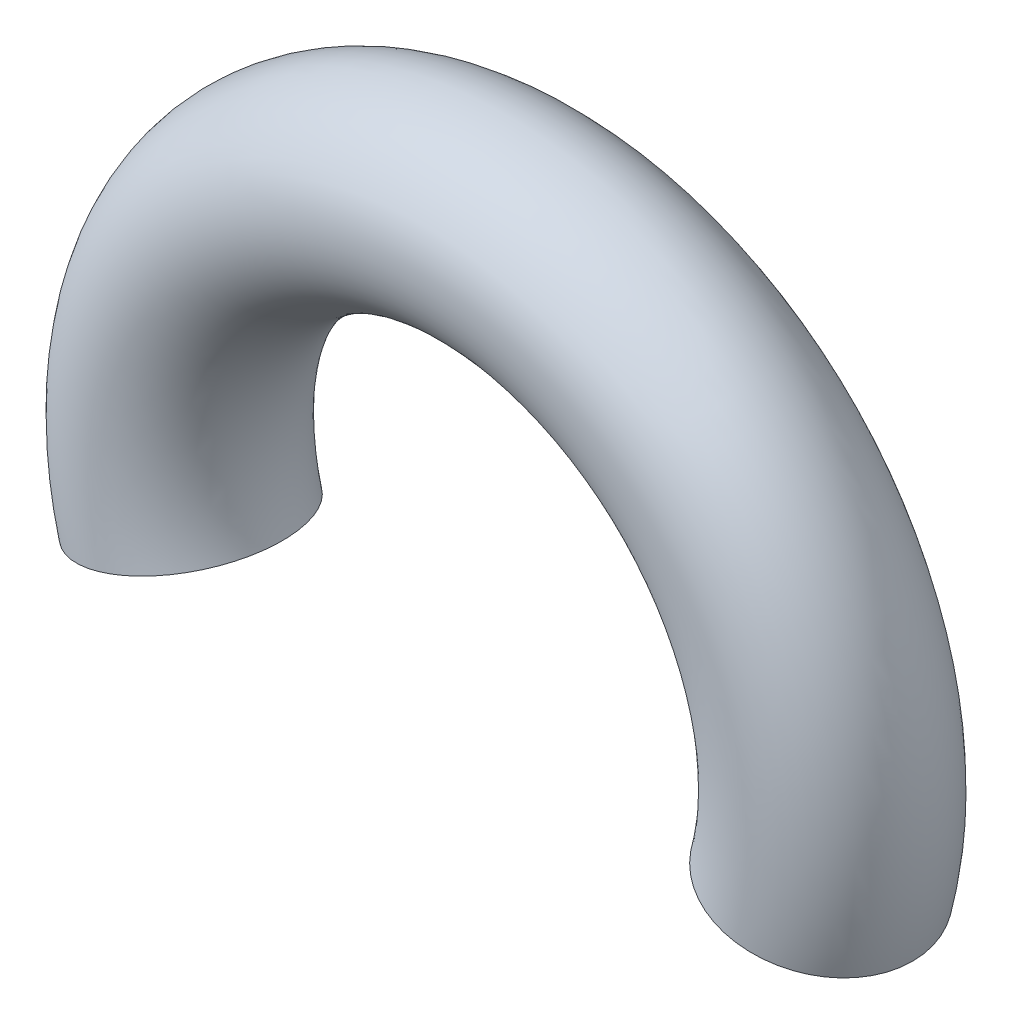
ISO-10303-21;
HEADER;
FILE_DESCRIPTION(('STEP AP214'),'2;1');
FILE_NAME('part.step','',(''),(''),'','','');
FILE_SCHEMA(('AUTOMOTIVE_DESIGN { 1 0 10303 214 1 1 1 1 }'));
ENDSEC;
DATA;
#1=APPLICATION_CONTEXT('core data for automotive mechanical design processes');
#2=APPLICATION_PROTOCOL_DEFINITION('international standard','automotive_design',2000,#1);
#3=PRODUCT_CONTEXT('',#1,'mechanical');
#4=PRODUCT('Part','Part','',(#3));
#5=PRODUCT_RELATED_PRODUCT_CATEGORY('part','',(#4));
#6=PRODUCT_DEFINITION_FORMATION('','',#4);
#7=PRODUCT_DEFINITION_CONTEXT('part definition',#1,'design');
#8=PRODUCT_DEFINITION('design','',#6,#7);
#9=PRODUCT_DEFINITION_SHAPE('','',#8);
#10=(LENGTH_UNIT() NAMED_UNIT(*) SI_UNIT(.MILLI.,.METRE.));
#11=(NAMED_UNIT(*) PLANE_ANGLE_UNIT() SI_UNIT($,.RADIAN.));
#12=(NAMED_UNIT(*) SI_UNIT($,.STERADIAN.) SOLID_ANGLE_UNIT());
#13=UNCERTAINTY_MEASURE_WITH_UNIT(LENGTH_MEASURE(1.E-05),#10,'distance_accuracy_value','');
#14=(GEOMETRIC_REPRESENTATION_CONTEXT(3) GLOBAL_UNCERTAINTY_ASSIGNED_CONTEXT((#13)) GLOBAL_UNIT_ASSIGNED_CONTEXT((#10,
#11,#12)) REPRESENTATION_CONTEXT('',''));
#15=CARTESIAN_POINT('',(0.,0.,0.));
#16=DIRECTION('',(0.,0.,1.));
#17=DIRECTION('',(1.,0.,0.));
#18=AXIS2_PLACEMENT_3D('',#15,#16,#17);
#19=CARTESIAN_POINT('',(-96.5925826289068,-25.8819045102522,0.));
#20=DIRECTION('',(-0.258819045102522,0.965925826289068,0.));
#21=DIRECTION('',(0.,0.,-1.));
#22=AXIS2_PLACEMENT_3D('',#19,#20,#21);
#23=PLANE('',#22);
#24=CARTESIAN_POINT('',(-96.5925826289068,-25.8819045102522,0.));
#25=DIRECTION('',(-0.258819045102522,0.965925826289068,0.));
#26=DIRECTION('',(-0.965925826289068,-0.258819045102522,0.));
#27=AXIS2_PLACEMENT_3D('',#24,#25,#26);
#28=CIRCLE('',#27,26.);
#29=CARTESIAN_POINT('',(-121.706654112423,-32.6111996829177,0.));
#30=VERTEX_POINT('',#29);
#31=EDGE_CURVE('E54',#30,#30,#28,.T.);
#32=ORIENTED_EDGE('',*,*,#31,.T.);
#33=EDGE_LOOP('',(#32));
#34=FACE_BOUND('',#33,.T.);
#35=CARTESIAN_POINT('',(-96.5925826289068,-25.8819045102522,0.));
#36=DIRECTION('',(-0.258819045102522,0.965925826289068,0.));
#37=DIRECTION('',(0.,0.,-1.));
#38=AXIS2_PLACEMENT_3D('',#35,#36,#37);
#39=CIRCLE('',#38,29.);
#40=CARTESIAN_POINT('',(-124.60443159129,-33.3876568182253,0.));
#41=VERTEX_POINT('',#40);
#42=EDGE_CURVE('E44',#41,#41,#39,.T.);
#43=ORIENTED_EDGE('',*,*,#42,.F.);
#44=EDGE_LOOP('',(#43));
#45=FACE_BOUND('',#44,.T.);
#46=ADVANCED_FACE('F37',(#34,#45),#23,.F.);
#47=CARTESIAN_POINT('',(96.5925826289068,-25.8819045102521,0.));
#48=DIRECTION('',(-0.258819045102522,-0.965925826289068,0.));
#49=DIRECTION('',(0.,0.,-1.));
#50=AXIS2_PLACEMENT_3D('',#47,#48,#49);
#51=PLANE('',#50);
#52=CARTESIAN_POINT('',(96.5925826289068,-25.8819045102521,0.));
#53=DIRECTION('',(-0.258819045102522,-0.965925826289068,0.));
#54=DIRECTION('',(0.965925826289068,-0.258819045102522,0.));
#55=AXIS2_PLACEMENT_3D('',#52,#53,#54);
#56=CIRCLE('',#55,26.);
#57=CARTESIAN_POINT('',(121.706654112423,-32.6111996829177,0.));
#58=VERTEX_POINT('',#57);
#59=EDGE_CURVE('E49',#58,#58,#56,.T.);
#60=ORIENTED_EDGE('',*,*,#59,.F.);
#61=EDGE_LOOP('',(#60));
#62=FACE_BOUND('',#61,.T.);
#63=CARTESIAN_POINT('',(96.5925826289068,-25.8819045102521,0.));
#64=DIRECTION('',(-0.258819045102522,-0.965925826289068,0.));
#65=DIRECTION('',(0.,0.,-1.));
#66=AXIS2_PLACEMENT_3D('',#63,#64,#65);
#67=CIRCLE('',#66,29.);
#68=CARTESIAN_POINT('',(124.60443159129,-33.3876568182253,0.));
#69=VERTEX_POINT('',#68);
#70=EDGE_CURVE('E10',#69,#69,#67,.T.);
#71=ORIENTED_EDGE('',*,*,#70,.T.);
#72=EDGE_LOOP('',(#71));
#73=FACE_BOUND('',#72,.T.);
#74=ADVANCED_FACE('F71',(#62,#73),#51,.T.);
#75=CARTESIAN_POINT('',(0.,0.,0.));
#76=DIRECTION('',(0.,0.,-1.));
#77=DIRECTION('',(-1.,0.,0.));
#78=AXIS2_PLACEMENT_3D('',#75,#76,#77);
#79=TOROIDAL_SURFACE('',#78,100.,29.);
#80=CARTESIAN_POINT('',(0.,0.,0.));
#81=DIRECTION('',(0.,0.,-1.));
#82=DIRECTION('',(-1.,0.,0.));
#83=AXIS2_PLACEMENT_3D('',#80,#81,#82);
#84=CIRCLE('',#83,129.);
#85=EDGE_CURVE('',#41,#69,#84,.T.);
#86=ORIENTED_EDGE('',*,*,#42,.T.);
#87=ORIENTED_EDGE('',*,*,#70,.F.);
#88=ORIENTED_EDGE('',*,*,#85,.T.);
#89=ORIENTED_EDGE('',*,*,#85,.F.);
#90=EDGE_LOOP('',(#86,#88,#87,#89));
#91=FACE_BOUND('',#90,.T.);
#92=ADVANCED_FACE('F65',(#91),#79,.T.);
#93=CARTESIAN_POINT('',(0.,0.,0.));
#94=DIRECTION('',(0.,0.,-1.));
#95=DIRECTION('',(-1.,0.,0.));
#96=AXIS2_PLACEMENT_3D('',#93,#94,#95);
#97=TOROIDAL_SURFACE('',#96,100.,26.);
#98=CARTESIAN_POINT('',(0.,0.,0.));
#99=DIRECTION('',(0.,0.,-1.));
#100=DIRECTION('',(-1.,0.,0.));
#101=AXIS2_PLACEMENT_3D('',#98,#99,#100);
#102=CIRCLE('',#101,126.);
#103=EDGE_CURVE('',#30,#58,#102,.T.);
#104=ORIENTED_EDGE('',*,*,#31,.F.);
#105=ORIENTED_EDGE('',*,*,#59,.T.);
#106=ORIENTED_EDGE('',*,*,#103,.T.);
#107=ORIENTED_EDGE('',*,*,#103,.F.);
#108=EDGE_LOOP('',(#104,#106,#105,#107));
#109=FACE_BOUND('',#108,.T.);
#110=ADVANCED_FACE('F63',(#109),#97,.F.);
#111=CLOSED_SHELL('',(#46,#74,#92,#110));
#112=MANIFOLD_SOLID_BREP('B2',#111);
#113=ADVANCED_BREP_SHAPE_REPRESENTATION('',(#18,#112),#14);
#114=SHAPE_DEFINITION_REPRESENTATION(#9,#113);
ENDSEC;
END-ISO-10303-21;
